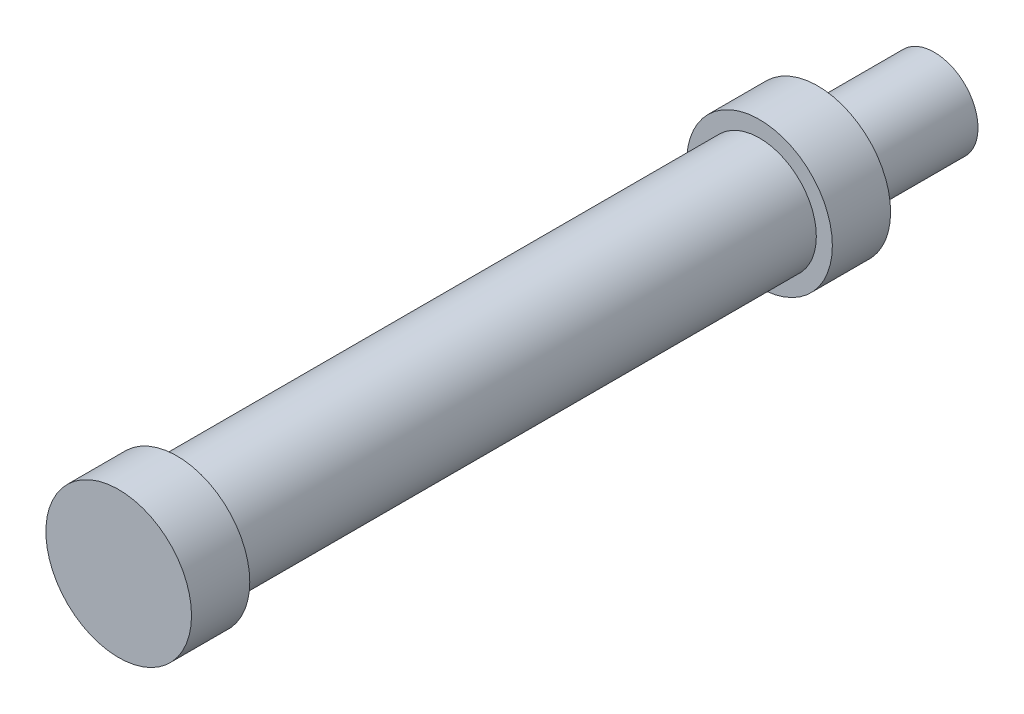
ISO-10303-21;
HEADER;
FILE_DESCRIPTION(('STEP AP214'),'2;1');
FILE_NAME('part.step','',(''),(''),'','','');
FILE_SCHEMA(('AUTOMOTIVE_DESIGN { 1 0 10303 214 1 1 1 1 }'));
ENDSEC;
DATA;
#1=APPLICATION_CONTEXT('core data for automotive mechanical design processes');
#2=APPLICATION_PROTOCOL_DEFINITION('international standard','automotive_design',2000,#1);
#3=PRODUCT_CONTEXT('',#1,'mechanical');
#4=PRODUCT('Part','Part','',(#3));
#5=PRODUCT_RELATED_PRODUCT_CATEGORY('part','',(#4));
#6=PRODUCT_DEFINITION_FORMATION('','',#4);
#7=PRODUCT_DEFINITION_CONTEXT('part definition',#1,'design');
#8=PRODUCT_DEFINITION('design','',#6,#7);
#9=PRODUCT_DEFINITION_SHAPE('','',#8);
#10=(LENGTH_UNIT() NAMED_UNIT(*) SI_UNIT(.MILLI.,.METRE.));
#11=(NAMED_UNIT(*) PLANE_ANGLE_UNIT() SI_UNIT($,.RADIAN.));
#12=(NAMED_UNIT(*) SI_UNIT($,.STERADIAN.) SOLID_ANGLE_UNIT());
#13=UNCERTAINTY_MEASURE_WITH_UNIT(LENGTH_MEASURE(1.E-05),#10,'distance_accuracy_value','');
#14=(GEOMETRIC_REPRESENTATION_CONTEXT(3) GLOBAL_UNCERTAINTY_ASSIGNED_CONTEXT((#13)) GLOBAL_UNIT_ASSIGNED_CONTEXT((#10,
#11,#12)) REPRESENTATION_CONTEXT('',''));
#15=CARTESIAN_POINT('',(0.,0.,0.));
#16=DIRECTION('',(0.,0.,1.));
#17=DIRECTION('',(1.,0.,0.));
#18=AXIS2_PLACEMENT_3D('',#15,#16,#17);
#19=CARTESIAN_POINT('',(0.,0.,4.));
#20=DIRECTION('',(0.,0.,-1.));
#21=DIRECTION('',(-1.,0.,0.));
#22=AXIS2_PLACEMENT_3D('',#19,#20,#21);
#23=CYLINDRICAL_SURFACE('',#22,1.5);
#24=CARTESIAN_POINT('',(0.,0.,4.));
#25=DIRECTION('',(0.,0.,1.));
#26=DIRECTION('',(1.,0.,0.));
#27=AXIS2_PLACEMENT_3D('',#24,#25,#26);
#28=CIRCLE('',#27,1.5);
#29=CARTESIAN_POINT('',(1.5,0.,4.));
#30=VERTEX_POINT('',#29);
#31=EDGE_CURVE('E42',#30,#30,#28,.T.);
#32=ORIENTED_EDGE('',*,*,#31,.F.);
#33=EDGE_LOOP('',(#32));
#34=FACE_BOUND('',#33,.T.);
#35=CARTESIAN_POINT('',(0.,0.,0.));
#36=DIRECTION('',(0.,0.,1.));
#37=DIRECTION('',(1.,0.,0.));
#38=AXIS2_PLACEMENT_3D('',#35,#36,#37);
#39=CIRCLE('',#38,1.5);
#40=CARTESIAN_POINT('',(1.5,0.,0.));
#41=VERTEX_POINT('',#40);
#42=EDGE_CURVE('E38',#41,#41,#39,.T.);
#43=ORIENTED_EDGE('',*,*,#42,.T.);
#44=EDGE_LOOP('',(#43));
#45=FACE_BOUND('',#44,.T.);
#46=ADVANCED_FACE('F35',(#34,#45),#23,.T.);
#47=CARTESIAN_POINT('',(0.,0.,0.));
#48=DIRECTION('',(0.,0.,1.));
#49=DIRECTION('',(1.,0.,0.));
#50=AXIS2_PLACEMENT_3D('',#47,#48,#49);
#51=PLANE('',#50);
#52=ORIENTED_EDGE('',*,*,#42,.F.);
#53=EDGE_LOOP('',(#52));
#54=FACE_BOUND('',#53,.T.);
#55=ADVANCED_FACE('F82',(#54),#51,.F.);
#56=CARTESIAN_POINT('',(0.,0.,6.));
#57=DIRECTION('',(0.,0.,-1.));
#58=DIRECTION('',(-1.,0.,0.));
#59=AXIS2_PLACEMENT_3D('',#56,#57,#58);
#60=CYLINDRICAL_SURFACE('',#59,2.5);
#61=CARTESIAN_POINT('',(0.,0.,6.));
#62=DIRECTION('',(0.,0.,1.));
#63=DIRECTION('',(1.,0.,0.));
#64=AXIS2_PLACEMENT_3D('',#61,#62,#63);
#65=CIRCLE('',#64,2.5);
#66=CARTESIAN_POINT('',(2.5,0.,6.));
#67=VERTEX_POINT('',#66);
#68=EDGE_CURVE('E51',#67,#67,#65,.T.);
#69=ORIENTED_EDGE('',*,*,#68,.F.);
#70=EDGE_LOOP('',(#69));
#71=FACE_BOUND('',#70,.T.);
#72=CARTESIAN_POINT('',(0.,0.,4.));
#73=DIRECTION('',(0.,0.,1.));
#74=DIRECTION('',(1.,0.,0.));
#75=AXIS2_PLACEMENT_3D('',#72,#73,#74);
#76=CIRCLE('',#75,2.5);
#77=CARTESIAN_POINT('',(2.5,0.,4.));
#78=VERTEX_POINT('',#77);
#79=EDGE_CURVE('E54',#78,#78,#76,.T.);
#80=ORIENTED_EDGE('',*,*,#79,.T.);
#81=EDGE_LOOP('',(#80));
#82=FACE_BOUND('',#81,.T.);
#83=ADVANCED_FACE('F87',(#71,#82),#60,.T.);
#84=CARTESIAN_POINT('',(0.,0.,6.));
#85=DIRECTION('',(0.,0.,1.));
#86=DIRECTION('',(1.,0.,0.));
#87=AXIS2_PLACEMENT_3D('',#84,#85,#86);
#88=PLANE('',#87);
#89=CARTESIAN_POINT('',(0.,0.,6.));
#90=DIRECTION('',(0.,0.,1.));
#91=DIRECTION('',(1.,0.,0.));
#92=AXIS2_PLACEMENT_3D('',#89,#90,#91);
#93=CIRCLE('',#92,1.95);
#94=CARTESIAN_POINT('',(1.95,0.,6.));
#95=VERTEX_POINT('',#94);
#96=EDGE_CURVE('E10',#95,#95,#93,.T.);
#97=ORIENTED_EDGE('',*,*,#96,.F.);
#98=EDGE_LOOP('',(#97));
#99=FACE_BOUND('',#98,.T.);
#100=ORIENTED_EDGE('',*,*,#68,.T.);
#101=EDGE_LOOP('',(#100));
#102=FACE_BOUND('',#101,.T.);
#103=ADVANCED_FACE('F98',(#99,#102),#88,.T.);
#104=CARTESIAN_POINT('',(0.,0.,4.));
#105=DIRECTION('',(0.,0.,1.));
#106=DIRECTION('',(1.,0.,0.));
#107=AXIS2_PLACEMENT_3D('',#104,#105,#106);
#108=PLANE('',#107);
#109=ORIENTED_EDGE('',*,*,#31,.T.);
#110=EDGE_LOOP('',(#109));
#111=FACE_BOUND('',#110,.T.);
#112=ORIENTED_EDGE('',*,*,#79,.F.);
#113=EDGE_LOOP('',(#112));
#114=FACE_BOUND('',#113,.T.);
#115=ADVANCED_FACE('F94',(#111,#114),#108,.F.);
#116=CARTESIAN_POINT('',(0.,0.,26.));
#117=DIRECTION('',(0.,0.,-1.));
#118=DIRECTION('',(-1.,0.,0.));
#119=AXIS2_PLACEMENT_3D('',#116,#117,#118);
#120=CYLINDRICAL_SURFACE('',#119,1.95);
#121=CARTESIAN_POINT('',(0.,0.,26.));
#122=DIRECTION('',(0.,0.,1.));
#123=DIRECTION('',(1.,0.,0.));
#124=AXIS2_PLACEMENT_3D('',#121,#122,#123);
#125=CIRCLE('',#124,1.95);
#126=CARTESIAN_POINT('',(1.95,0.,26.));
#127=VERTEX_POINT('',#126);
#128=EDGE_CURVE('E49',#127,#127,#125,.T.);
#129=ORIENTED_EDGE('',*,*,#128,.F.);
#130=EDGE_LOOP('',(#129));
#131=FACE_BOUND('',#130,.T.);
#132=ORIENTED_EDGE('',*,*,#96,.T.);
#133=EDGE_LOOP('',(#132));
#134=FACE_BOUND('',#133,.T.);
#135=ADVANCED_FACE('F97',(#131,#134),#120,.T.);
#136=CARTESIAN_POINT('',(0.,0.,28.));
#137=DIRECTION('',(0.,0.,-1.));
#138=DIRECTION('',(-1.,0.,0.));
#139=AXIS2_PLACEMENT_3D('',#136,#137,#138);
#140=CYLINDRICAL_SURFACE('',#139,2.5);
#141=CARTESIAN_POINT('',(0.,0.,28.));
#142=DIRECTION('',(0.,0.,1.));
#143=DIRECTION('',(1.,0.,0.));
#144=AXIS2_PLACEMENT_3D('',#141,#142,#143);
#145=CIRCLE('',#144,2.5);
#146=CARTESIAN_POINT('',(2.5,0.,28.));
#147=VERTEX_POINT('',#146);
#148=EDGE_CURVE('E59',#147,#147,#145,.T.);
#149=ORIENTED_EDGE('',*,*,#148,.F.);
#150=EDGE_LOOP('',(#149));
#151=FACE_BOUND('',#150,.T.);
#152=CARTESIAN_POINT('',(0.,0.,26.));
#153=DIRECTION('',(0.,0.,1.));
#154=DIRECTION('',(1.,0.,0.));
#155=AXIS2_PLACEMENT_3D('',#152,#153,#154);
#156=CIRCLE('',#155,2.5);
#157=CARTESIAN_POINT('',(2.5,0.,26.));
#158=VERTEX_POINT('',#157);
#159=EDGE_CURVE('E63',#158,#158,#156,.T.);
#160=ORIENTED_EDGE('',*,*,#159,.T.);
#161=EDGE_LOOP('',(#160));
#162=FACE_BOUND('',#161,.T.);
#163=ADVANCED_FACE('F70',(#151,#162),#140,.T.);
#164=CARTESIAN_POINT('',(0.,0.,28.));
#165=DIRECTION('',(0.,0.,1.));
#166=DIRECTION('',(1.,0.,0.));
#167=AXIS2_PLACEMENT_3D('',#164,#165,#166);
#168=PLANE('',#167);
#169=ORIENTED_EDGE('',*,*,#148,.T.);
#170=EDGE_LOOP('',(#169));
#171=FACE_BOUND('',#170,.T.);
#172=ADVANCED_FACE('F74',(#171),#168,.T.);
#173=CARTESIAN_POINT('',(0.,0.,26.));
#174=DIRECTION('',(0.,0.,1.));
#175=DIRECTION('',(1.,0.,0.));
#176=AXIS2_PLACEMENT_3D('',#173,#174,#175);
#177=PLANE('',#176);
#178=ORIENTED_EDGE('',*,*,#128,.T.);
#179=EDGE_LOOP('',(#178));
#180=FACE_BOUND('',#179,.T.);
#181=ORIENTED_EDGE('',*,*,#159,.F.);
#182=EDGE_LOOP('',(#181));
#183=FACE_BOUND('',#182,.T.);
#184=ADVANCED_FACE('F72',(#180,#183),#177,.F.);
#185=CLOSED_SHELL('',(#46,#55,#83,#103,#115,#135,#163,#172,#184));
#186=MANIFOLD_SOLID_BREP('B2',#185);
#187=ADVANCED_BREP_SHAPE_REPRESENTATION('',(#18,#186),#14);
#188=SHAPE_DEFINITION_REPRESENTATION(#9,#187);
ENDSEC;
END-ISO-10303-21;
